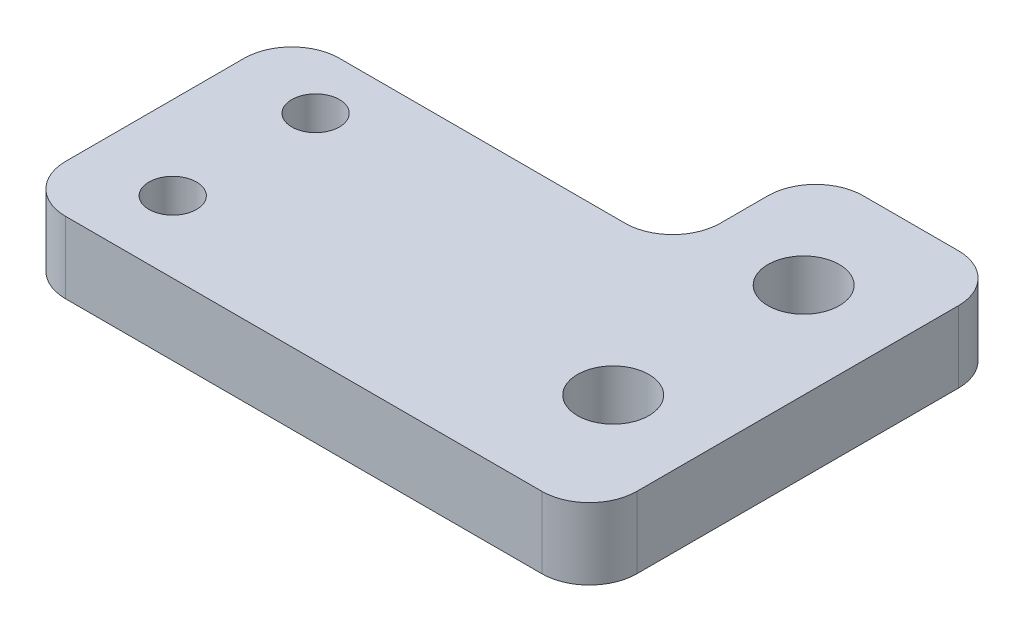
ISO-10303-21;
HEADER;
FILE_DESCRIPTION(('STEP AP214'),'2;1');
FILE_NAME('part.step','',(''),(''),'','','');
FILE_SCHEMA(('AUTOMOTIVE_DESIGN { 1 0 10303 214 1 1 1 1 }'));
ENDSEC;
DATA;
#1=APPLICATION_CONTEXT('core data for automotive mechanical design processes');
#2=APPLICATION_PROTOCOL_DEFINITION('international standard','automotive_design',2000,#1);
#3=PRODUCT_CONTEXT('',#1,'mechanical');
#4=PRODUCT('Part','Part','',(#3));
#5=PRODUCT_RELATED_PRODUCT_CATEGORY('part','',(#4));
#6=PRODUCT_DEFINITION_FORMATION('','',#4);
#7=PRODUCT_DEFINITION_CONTEXT('part definition',#1,'design');
#8=PRODUCT_DEFINITION('design','',#6,#7);
#9=PRODUCT_DEFINITION_SHAPE('','',#8);
#10=(LENGTH_UNIT() NAMED_UNIT(*) SI_UNIT(.MILLI.,.METRE.));
#11=(NAMED_UNIT(*) PLANE_ANGLE_UNIT() SI_UNIT($,.RADIAN.));
#12=(NAMED_UNIT(*) SI_UNIT($,.STERADIAN.) SOLID_ANGLE_UNIT());
#13=UNCERTAINTY_MEASURE_WITH_UNIT(LENGTH_MEASURE(1.E-05),#10,'distance_accuracy_value','');
#14=(GEOMETRIC_REPRESENTATION_CONTEXT(3) GLOBAL_UNCERTAINTY_ASSIGNED_CONTEXT((#13)) GLOBAL_UNIT_ASSIGNED_CONTEXT((#10,
#11,#12)) REPRESENTATION_CONTEXT('',''));
#15=CARTESIAN_POINT('',(0.,0.,0.));
#16=DIRECTION('',(0.,0.,1.));
#17=DIRECTION('',(1.,0.,0.));
#18=AXIS2_PLACEMENT_3D('',#15,#16,#17);
#19=CARTESIAN_POINT('',(-1.5,3.,0.));
#20=DIRECTION('',(-1.,0.,0.));
#21=DIRECTION('',(0.,0.,1.));
#22=AXIS2_PLACEMENT_3D('',#19,#20,#21);
#23=PLANE('',#22);
#24=DIRECTION('',(0.,0.,-1.));
#25=VECTOR('',#24,1.);
#26=CARTESIAN_POINT('',(-1.5,3.,0.));
#27=LINE('',#26,#25);
#28=CARTESIAN_POINT('',(-1.5,3.,-4.5));
#29=VERTEX_POINT('',#28);
#30=CARTESIAN_POINT('',(-1.5,3.,-6.5));
#31=VERTEX_POINT('',#30);
#32=EDGE_CURVE('E179',#29,#31,#27,.T.);
#33=ORIENTED_EDGE('',*,*,#32,.T.);
#34=DIRECTION('',(0.,1.,0.));
#35=VECTOR('',#34,1.);
#36=CARTESIAN_POINT('',(-1.5,0.,-6.5));
#37=LINE('',#36,#35);
#38=CARTESIAN_POINT('',(-1.5,0.,-6.5));
#39=VERTEX_POINT('',#38);
#40=EDGE_CURVE('E58',#31,#39,#37,.F.);
#41=ORIENTED_EDGE('',*,*,#40,.T.);
#42=DIRECTION('',(0.,0.,-1.));
#43=VECTOR('',#42,1.);
#44=CARTESIAN_POINT('',(-1.5,0.,0.));
#45=LINE('',#44,#43);
#46=CARTESIAN_POINT('',(-1.5,0.,-4.5));
#47=VERTEX_POINT('',#46);
#48=EDGE_CURVE('E198',#47,#39,#45,.T.);
#49=ORIENTED_EDGE('',*,*,#48,.F.);
#50=DIRECTION('',(0.,-1.,0.));
#51=VECTOR('',#50,1.);
#52=CARTESIAN_POINT('',(-1.5,3.,-4.5));
#53=LINE('',#52,#51);
#54=EDGE_CURVE('E230',#47,#29,#53,.F.);
#55=ORIENTED_EDGE('',*,*,#54,.T.);
#56=EDGE_LOOP('',(#33,#41,#49,#55));
#57=FACE_BOUND('',#56,.T.);
#58=ADVANCED_FACE('F43',(#57),#23,.T.);
#59=CARTESIAN_POINT('',(0.,3.,-2.5));
#60=DIRECTION('',(0.,0.,-1.));
#61=DIRECTION('',(-1.,0.,0.));
#62=AXIS2_PLACEMENT_3D('',#59,#60,#61);
#63=PLANE('',#62);
#64=DIRECTION('',(1.,0.,0.));
#65=VECTOR('',#64,1.);
#66=CARTESIAN_POINT('',(0.,0.,-2.5));
#67=LINE('',#66,#65);
#68=CARTESIAN_POINT('',(-15.5,0.,-2.5));
#69=VERTEX_POINT('',#68);
#70=CARTESIAN_POINT('',(-3.5,0.,-2.5));
#71=VERTEX_POINT('',#70);
#72=EDGE_CURVE('E200',#69,#71,#67,.T.);
#73=ORIENTED_EDGE('',*,*,#72,.F.);
#74=DIRECTION('',(0.,-1.,0.));
#75=VECTOR('',#74,1.);
#76=CARTESIAN_POINT('',(-15.5,3.,-2.5));
#77=LINE('',#76,#75);
#78=CARTESIAN_POINT('',(-15.5,3.,-2.5));
#79=VERTEX_POINT('',#78);
#80=EDGE_CURVE('E247',#69,#79,#77,.F.);
#81=ORIENTED_EDGE('',*,*,#80,.T.);
#82=DIRECTION('',(1.,0.,0.));
#83=VECTOR('',#82,1.);
#84=CARTESIAN_POINT('',(0.,3.,-2.5));
#85=LINE('',#84,#83);
#86=CARTESIAN_POINT('',(-3.5,3.,-2.5));
#87=VERTEX_POINT('',#86);
#88=EDGE_CURVE('E181',#79,#87,#85,.T.);
#89=ORIENTED_EDGE('',*,*,#88,.T.);
#90=DIRECTION('',(0.,-1.,0.));
#91=VECTOR('',#90,1.);
#92=CARTESIAN_POINT('',(-3.5,0.,-2.5));
#93=LINE('',#92,#91);
#94=EDGE_CURVE('E244',#87,#71,#93,.T.);
#95=ORIENTED_EDGE('',*,*,#94,.T.);
#96=EDGE_LOOP('',(#73,#81,#89,#95));
#97=FACE_BOUND('',#96,.T.);
#98=ADVANCED_FACE('F252',(#97),#63,.T.);
#99=CARTESIAN_POINT('',(-17.5,3.,0.));
#100=DIRECTION('',(-1.,0.,0.));
#101=DIRECTION('',(0.,0.,1.));
#102=AXIS2_PLACEMENT_3D('',#99,#100,#101);
#103=PLANE('',#102);
#104=DIRECTION('',(0.,0.,-1.));
#105=VECTOR('',#104,1.);
#106=CARTESIAN_POINT('',(-17.5,0.,0.));
#107=LINE('',#106,#105);
#108=CARTESIAN_POINT('',(-17.5,0.,7.));
#109=VERTEX_POINT('',#108);
#110=CARTESIAN_POINT('',(-17.5,0.,-0.499999999999998));
#111=VERTEX_POINT('',#110);
#112=EDGE_CURVE('E202',#109,#111,#107,.T.);
#113=ORIENTED_EDGE('',*,*,#112,.F.);
#114=DIRECTION('',(0.,-1.,0.));
#115=VECTOR('',#114,1.);
#116=CARTESIAN_POINT('',(-17.5,3.,7.));
#117=LINE('',#116,#115);
#118=CARTESIAN_POINT('',(-17.5,3.,7.));
#119=VERTEX_POINT('',#118);
#120=EDGE_CURVE('E242',#109,#119,#117,.F.);
#121=ORIENTED_EDGE('',*,*,#120,.T.);
#122=DIRECTION('',(0.,0.,-1.));
#123=VECTOR('',#122,1.);
#124=CARTESIAN_POINT('',(-17.5,3.,0.));
#125=LINE('',#124,#123);
#126=CARTESIAN_POINT('',(-17.5,3.,-0.499999999999998));
#127=VERTEX_POINT('',#126);
#128=EDGE_CURVE('E184',#119,#127,#125,.T.);
#129=ORIENTED_EDGE('',*,*,#128,.T.);
#130=DIRECTION('',(0.,-1.,0.));
#131=VECTOR('',#130,1.);
#132=CARTESIAN_POINT('',(-17.5,3.,-0.499999999999998));
#133=LINE('',#132,#131);
#134=EDGE_CURVE('E239',#127,#111,#133,.T.);
#135=ORIENTED_EDGE('',*,*,#134,.T.);
#136=EDGE_LOOP('',(#113,#121,#129,#135));
#137=FACE_BOUND('',#136,.T.);
#138=ADVANCED_FACE('F263',(#137),#103,.T.);
#139=CARTESIAN_POINT('',(0.,3.,9.));
#140=DIRECTION('',(0.,0.,-1.));
#141=DIRECTION('',(-1.,0.,0.));
#142=AXIS2_PLACEMENT_3D('',#139,#140,#141);
#143=PLANE('',#142);
#144=DIRECTION('',(1.,0.,0.));
#145=VECTOR('',#144,1.);
#146=CARTESIAN_POINT('',(0.,3.,9.));
#147=LINE('',#146,#145);
#148=CARTESIAN_POINT('',(-15.5,3.,9.));
#149=VERTEX_POINT('',#148);
#150=CARTESIAN_POINT('',(4.50000000000001,3.,9.));
#151=VERTEX_POINT('',#150);
#152=EDGE_CURVE('E187',#149,#151,#147,.T.);
#153=ORIENTED_EDGE('',*,*,#152,.F.);
#154=DIRECTION('',(0.,-1.,0.));
#155=VECTOR('',#154,1.);
#156=CARTESIAN_POINT('',(-15.5,0.,9.));
#157=LINE('',#156,#155);
#158=CARTESIAN_POINT('',(-15.5,0.,9.));
#159=VERTEX_POINT('',#158);
#160=EDGE_CURVE('E236',#149,#159,#157,.T.);
#161=ORIENTED_EDGE('',*,*,#160,.T.);
#162=DIRECTION('',(1.,0.,0.));
#163=VECTOR('',#162,1.);
#164=CARTESIAN_POINT('',(0.,0.,9.));
#165=LINE('',#164,#163);
#166=CARTESIAN_POINT('',(4.50000000000001,0.,9.));
#167=VERTEX_POINT('',#166);
#168=EDGE_CURVE('E170',#159,#167,#165,.T.);
#169=ORIENTED_EDGE('',*,*,#168,.T.);
#170=DIRECTION('',(0.,1.,0.));
#171=VECTOR('',#170,1.);
#172=CARTESIAN_POINT('',(4.50000000000001,3.,9.));
#173=LINE('',#172,#171);
#174=EDGE_CURVE('E233',#167,#151,#173,.T.);
#175=ORIENTED_EDGE('',*,*,#174,.T.);
#176=EDGE_LOOP('',(#153,#161,#169,#175));
#177=FACE_BOUND('',#176,.T.);
#178=ADVANCED_FACE('F273',(#177),#143,.F.);
#179=CARTESIAN_POINT('',(2.5,3.,-4.));
#180=DIRECTION('',(0.,-1.,0.));
#181=DIRECTION('',(0.,0.,-1.));
#182=AXIS2_PLACEMENT_3D('',#179,#180,#181);
#183=CYLINDRICAL_SURFACE('',#182,1.5);
#184=CARTESIAN_POINT('',(2.5,3.,-4.));
#185=DIRECTION('',(0.,1.,0.));
#186=DIRECTION('',(0.,0.,1.));
#187=AXIS2_PLACEMENT_3D('',#184,#185,#186);
#188=CIRCLE('',#187,1.5);
#189=CARTESIAN_POINT('',(2.5,3.,-2.5));
#190=VERTEX_POINT('',#189);
#191=EDGE_CURVE('E176',#190,#190,#188,.T.);
#192=ORIENTED_EDGE('',*,*,#191,.T.);
#193=EDGE_LOOP('',(#192));
#194=FACE_BOUND('',#193,.T.);
#195=CARTESIAN_POINT('',(2.5,0.,-4.));
#196=DIRECTION('',(0.,1.,0.));
#197=DIRECTION('',(0.,0.,1.));
#198=AXIS2_PLACEMENT_3D('',#195,#196,#197);
#199=CIRCLE('',#198,1.5);
#200=CARTESIAN_POINT('',(2.5,0.,-2.5));
#201=VERTEX_POINT('',#200);
#202=EDGE_CURVE('E195',#201,#201,#199,.T.);
#203=ORIENTED_EDGE('',*,*,#202,.F.);
#204=EDGE_LOOP('',(#203));
#205=FACE_BOUND('',#204,.T.);
#206=ADVANCED_FACE('F302',(#194,#205),#183,.F.);
#207=CARTESIAN_POINT('',(2.50000000000001,3.,4.));
#208=DIRECTION('',(0.,-1.,0.));
#209=DIRECTION('',(0.,0.,-1.));
#210=AXIS2_PLACEMENT_3D('',#207,#208,#209);
#211=CYLINDRICAL_SURFACE('',#210,1.5);
#212=CARTESIAN_POINT('',(2.50000000000001,3.,4.));
#213=DIRECTION('',(0.,1.,0.));
#214=DIRECTION('',(0.,0.,1.));
#215=AXIS2_PLACEMENT_3D('',#212,#213,#214);
#216=CIRCLE('',#215,1.5);
#217=CARTESIAN_POINT('',(2.50000000000001,3.,5.5));
#218=VERTEX_POINT('',#217);
#219=EDGE_CURVE('E173',#218,#218,#216,.T.);
#220=ORIENTED_EDGE('',*,*,#219,.T.);
#221=EDGE_LOOP('',(#220));
#222=FACE_BOUND('',#221,.T.);
#223=CARTESIAN_POINT('',(2.50000000000001,0.,4.));
#224=DIRECTION('',(0.,1.,0.));
#225=DIRECTION('',(0.,0.,1.));
#226=AXIS2_PLACEMENT_3D('',#223,#224,#225);
#227=CIRCLE('',#226,1.5);
#228=CARTESIAN_POINT('',(2.50000000000001,0.,5.5));
#229=VERTEX_POINT('',#228);
#230=EDGE_CURVE('E192',#229,#229,#227,.T.);
#231=ORIENTED_EDGE('',*,*,#230,.F.);
#232=EDGE_LOOP('',(#231));
#233=FACE_BOUND('',#232,.T.);
#234=ADVANCED_FACE('F305',(#222,#233),#211,.F.);
#235=CARTESIAN_POINT('',(-14.,3.,0.));
#236=DIRECTION('',(0.,-1.,0.));
#237=DIRECTION('',(0.,0.,-1.));
#238=AXIS2_PLACEMENT_3D('',#235,#236,#237);
#239=CYLINDRICAL_SURFACE('',#238,1.);
#240=CARTESIAN_POINT('',(-14.,3.,0.));
#241=DIRECTION('',(0.,1.,0.));
#242=DIRECTION('',(0.,0.,1.));
#243=AXIS2_PLACEMENT_3D('',#240,#241,#242);
#244=CIRCLE('',#243,1.);
#245=CARTESIAN_POINT('',(-14.,3.,1.));
#246=VERTEX_POINT('',#245);
#247=EDGE_CURVE('E169',#246,#246,#244,.T.);
#248=ORIENTED_EDGE('',*,*,#247,.T.);
#249=EDGE_LOOP('',(#248));
#250=FACE_BOUND('',#249,.T.);
#251=CARTESIAN_POINT('',(-14.,0.,0.));
#252=DIRECTION('',(0.,1.,0.));
#253=DIRECTION('',(0.,0.,1.));
#254=AXIS2_PLACEMENT_3D('',#251,#252,#253);
#255=CIRCLE('',#254,1.);
#256=CARTESIAN_POINT('',(-14.,0.,1.));
#257=VERTEX_POINT('',#256);
#258=EDGE_CURVE('E162',#257,#257,#255,.T.);
#259=ORIENTED_EDGE('',*,*,#258,.F.);
#260=EDGE_LOOP('',(#259));
#261=FACE_BOUND('',#260,.T.);
#262=ADVANCED_FACE('F309',(#250,#261),#239,.F.);
#263=CARTESIAN_POINT('',(-14.,3.,6.));
#264=DIRECTION('',(0.,-1.,0.));
#265=DIRECTION('',(0.,0.,-1.));
#266=AXIS2_PLACEMENT_3D('',#263,#264,#265);
#267=CYLINDRICAL_SURFACE('',#266,1.);
#268=CARTESIAN_POINT('',(-14.,3.,6.));
#269=DIRECTION('',(0.,1.,0.));
#270=DIRECTION('',(0.,0.,1.));
#271=AXIS2_PLACEMENT_3D('',#268,#269,#270);
#272=CIRCLE('',#271,1.);
#273=CARTESIAN_POINT('',(-14.,3.,7.));
#274=VERTEX_POINT('',#273);
#275=EDGE_CURVE('E166',#274,#274,#272,.T.);
#276=ORIENTED_EDGE('',*,*,#275,.T.);
#277=EDGE_LOOP('',(#276));
#278=FACE_BOUND('',#277,.T.);
#279=CARTESIAN_POINT('',(-14.,0.,6.));
#280=DIRECTION('',(0.,1.,0.));
#281=DIRECTION('',(0.,0.,1.));
#282=AXIS2_PLACEMENT_3D('',#279,#280,#281);
#283=CIRCLE('',#282,1.);
#284=CARTESIAN_POINT('',(-14.,0.,7.));
#285=VERTEX_POINT('',#284);
#286=EDGE_CURVE('E158',#285,#285,#283,.T.);
#287=ORIENTED_EDGE('',*,*,#286,.F.);
#288=EDGE_LOOP('',(#287));
#289=FACE_BOUND('',#288,.T.);
#290=ADVANCED_FACE('F313',(#278,#289),#267,.F.);
#291=CARTESIAN_POINT('',(0.,3.,0.));
#292=DIRECTION('',(0.,1.,0.));
#293=DIRECTION('',(0.,0.,1.));
#294=AXIS2_PLACEMENT_3D('',#291,#292,#293);
#295=PLANE('',#294);
#296=DIRECTION('',(0.,0.,1.));
#297=VECTOR('',#296,1.);
#298=CARTESIAN_POINT('',(6.5,3.,0.));
#299=LINE('',#298,#297);
#300=CARTESIAN_POINT('',(6.5,3.,-6.5));
#301=VERTEX_POINT('',#300);
#302=CARTESIAN_POINT('',(6.50000000000001,3.,7.));
#303=VERTEX_POINT('',#302);
#304=EDGE_CURVE('E148',#301,#303,#299,.T.);
#305=ORIENTED_EDGE('',*,*,#304,.F.);
#306=CARTESIAN_POINT('',(4.5,3.,-6.5));
#307=DIRECTION('',(0.,1.,0.));
#308=DIRECTION('',(0.,0.,1.));
#309=AXIS2_PLACEMENT_3D('',#306,#307,#308);
#310=CIRCLE('',#309,2.);
#311=CARTESIAN_POINT('',(4.5,3.,-8.5));
#312=VERTEX_POINT('',#311);
#313=EDGE_CURVE('E131',#301,#312,#310,.T.);
#314=ORIENTED_EDGE('',*,*,#313,.T.);
#315=DIRECTION('',(1.,0.,0.));
#316=VECTOR('',#315,1.);
#317=CARTESIAN_POINT('',(0.,3.,-8.5));
#318=LINE('',#317,#316);
#319=CARTESIAN_POINT('',(0.499999999999995,3.,-8.5));
#320=VERTEX_POINT('',#319);
#321=EDGE_CURVE('E159',#320,#312,#318,.T.);
#322=ORIENTED_EDGE('',*,*,#321,.F.);
#323=CARTESIAN_POINT('',(0.499999999999995,3.,-6.5));
#324=DIRECTION('',(0.,1.,0.));
#325=DIRECTION('',(0.,0.,1.));
#326=AXIS2_PLACEMENT_3D('',#323,#324,#325);
#327=CIRCLE('',#326,2.);
#328=EDGE_CURVE('E142',#320,#31,#327,.T.);
#329=ORIENTED_EDGE('',*,*,#328,.T.);
#330=ORIENTED_EDGE('',*,*,#32,.F.);
#331=CARTESIAN_POINT('',(-3.5,3.,-4.5));
#332=DIRECTION('',(0.,1.,0.));
#333=DIRECTION('',(0.,0.,1.));
#334=AXIS2_PLACEMENT_3D('',#331,#332,#333);
#335=CIRCLE('',#334,2.);
#336=EDGE_CURVE('E11',#29,#87,#335,.F.);
#337=ORIENTED_EDGE('',*,*,#336,.T.);
#338=ORIENTED_EDGE('',*,*,#88,.F.);
#339=CARTESIAN_POINT('',(-15.5,3.,-0.499999999999998));
#340=DIRECTION('',(0.,1.,0.));
#341=DIRECTION('',(0.,0.,1.));
#342=AXIS2_PLACEMENT_3D('',#339,#340,#341);
#343=CIRCLE('',#342,2.);
#344=EDGE_CURVE('E212',#79,#127,#343,.T.);
#345=ORIENTED_EDGE('',*,*,#344,.T.);
#346=ORIENTED_EDGE('',*,*,#128,.F.);
#347=CARTESIAN_POINT('',(-15.5,3.,7.));
#348=DIRECTION('',(0.,1.,0.));
#349=DIRECTION('',(0.,0.,1.));
#350=AXIS2_PLACEMENT_3D('',#347,#348,#349);
#351=CIRCLE('',#350,2.);
#352=EDGE_CURVE('E214',#119,#149,#351,.T.);
#353=ORIENTED_EDGE('',*,*,#352,.T.);
#354=ORIENTED_EDGE('',*,*,#152,.T.);
#355=CARTESIAN_POINT('',(4.50000000000001,3.,7.));
#356=DIRECTION('',(0.,1.,0.));
#357=DIRECTION('',(0.,0.,1.));
#358=AXIS2_PLACEMENT_3D('',#355,#356,#357);
#359=CIRCLE('',#358,2.);
#360=EDGE_CURVE('E152',#151,#303,#359,.T.);
#361=ORIENTED_EDGE('',*,*,#360,.T.);
#362=EDGE_LOOP('',(#305,#314,#322,#329,#330,#337,#338,#345,#346,#353,#354,#361));
#363=FACE_BOUND('',#362,.T.);
#364=ORIENTED_EDGE('',*,*,#275,.F.);
#365=EDGE_LOOP('',(#364));
#366=FACE_BOUND('',#365,.T.);
#367=ORIENTED_EDGE('',*,*,#247,.F.);
#368=EDGE_LOOP('',(#367));
#369=FACE_BOUND('',#368,.T.);
#370=ORIENTED_EDGE('',*,*,#219,.F.);
#371=EDGE_LOOP('',(#370));
#372=FACE_BOUND('',#371,.T.);
#373=ORIENTED_EDGE('',*,*,#191,.F.);
#374=EDGE_LOOP('',(#373));
#375=FACE_BOUND('',#374,.T.);
#376=ADVANCED_FACE('F155',(#363,#366,#369,#372,#375),#295,.T.);
#377=CARTESIAN_POINT('',(0.,0.,0.));
#378=DIRECTION('',(0.,1.,0.));
#379=DIRECTION('',(0.,0.,1.));
#380=AXIS2_PLACEMENT_3D('',#377,#378,#379);
#381=PLANE('',#380);
#382=ORIENTED_EDGE('',*,*,#286,.T.);
#383=EDGE_LOOP('',(#382));
#384=FACE_BOUND('',#383,.T.);
#385=ORIENTED_EDGE('',*,*,#258,.T.);
#386=EDGE_LOOP('',(#385));
#387=FACE_BOUND('',#386,.T.);
#388=ORIENTED_EDGE('',*,*,#230,.T.);
#389=EDGE_LOOP('',(#388));
#390=FACE_BOUND('',#389,.T.);
#391=ORIENTED_EDGE('',*,*,#202,.T.);
#392=EDGE_LOOP('',(#391));
#393=FACE_BOUND('',#392,.T.);
#394=DIRECTION('',(1.,0.,0.));
#395=VECTOR('',#394,1.);
#396=CARTESIAN_POINT('',(0.,0.,-8.5));
#397=LINE('',#396,#395);
#398=CARTESIAN_POINT('',(0.499999999999995,0.,-8.5));
#399=VERTEX_POINT('',#398);
#400=CARTESIAN_POINT('',(4.5,0.,-8.5));
#401=VERTEX_POINT('',#400);
#402=EDGE_CURVE('E188',#399,#401,#397,.T.);
#403=ORIENTED_EDGE('',*,*,#402,.T.);
#404=CARTESIAN_POINT('',(4.5,0.,-6.5));
#405=DIRECTION('',(0.,1.,0.));
#406=DIRECTION('',(0.,0.,1.));
#407=AXIS2_PLACEMENT_3D('',#404,#405,#406);
#408=CIRCLE('',#407,2.);
#409=CARTESIAN_POINT('',(6.5,0.,-6.5));
#410=VERTEX_POINT('',#409);
#411=EDGE_CURVE('E228',#401,#410,#408,.F.);
#412=ORIENTED_EDGE('',*,*,#411,.T.);
#413=DIRECTION('',(0.,0.,1.));
#414=VECTOR('',#413,1.);
#415=CARTESIAN_POINT('',(6.5,0.,0.));
#416=LINE('',#415,#414);
#417=CARTESIAN_POINT('',(6.50000000000001,0.,7.));
#418=VERTEX_POINT('',#417);
#419=EDGE_CURVE('E151',#410,#418,#416,.T.);
#420=ORIENTED_EDGE('',*,*,#419,.T.);
#421=CARTESIAN_POINT('',(4.50000000000001,0.,7.));
#422=DIRECTION('',(0.,1.,0.));
#423=DIRECTION('',(0.,0.,1.));
#424=AXIS2_PLACEMENT_3D('',#421,#422,#423);
#425=CIRCLE('',#424,2.);
#426=EDGE_CURVE('E220',#418,#167,#425,.F.);
#427=ORIENTED_EDGE('',*,*,#426,.T.);
#428=ORIENTED_EDGE('',*,*,#168,.F.);
#429=CARTESIAN_POINT('',(-15.5,0.,7.));
#430=DIRECTION('',(0.,1.,0.));
#431=DIRECTION('',(0.,0.,1.));
#432=AXIS2_PLACEMENT_3D('',#429,#430,#431);
#433=CIRCLE('',#432,2.);
#434=EDGE_CURVE('E224',#159,#109,#433,.F.);
#435=ORIENTED_EDGE('',*,*,#434,.T.);
#436=ORIENTED_EDGE('',*,*,#112,.T.);
#437=CARTESIAN_POINT('',(-15.5,0.,-0.499999999999998));
#438=DIRECTION('',(0.,1.,0.));
#439=DIRECTION('',(0.,0.,1.));
#440=AXIS2_PLACEMENT_3D('',#437,#438,#439);
#441=CIRCLE('',#440,2.);
#442=EDGE_CURVE('E222',#111,#69,#441,.F.);
#443=ORIENTED_EDGE('',*,*,#442,.T.);
#444=ORIENTED_EDGE('',*,*,#72,.T.);
#445=CARTESIAN_POINT('',(-3.5,0.,-4.5));
#446=DIRECTION('',(0.,1.,0.));
#447=DIRECTION('',(0.,0.,1.));
#448=AXIS2_PLACEMENT_3D('',#445,#446,#447);
#449=CIRCLE('',#448,2.);
#450=EDGE_CURVE('E51',#71,#47,#449,.T.);
#451=ORIENTED_EDGE('',*,*,#450,.T.);
#452=ORIENTED_EDGE('',*,*,#48,.T.);
#453=CARTESIAN_POINT('',(0.499999999999995,0.,-6.5));
#454=DIRECTION('',(0.,1.,0.));
#455=DIRECTION('',(0.,0.,1.));
#456=AXIS2_PLACEMENT_3D('',#453,#454,#455);
#457=CIRCLE('',#456,2.);
#458=EDGE_CURVE('E226',#39,#399,#457,.F.);
#459=ORIENTED_EDGE('',*,*,#458,.T.);
#460=EDGE_LOOP('',(#403,#412,#420,#427,#428,#435,#436,#443,#444,#451,#452,#459));
#461=FACE_BOUND('',#460,.T.);
#462=ADVANCED_FACE('F265',(#384,#387,#390,#393,#461),#381,.F.);
#463=CARTESIAN_POINT('',(6.5,-7.,0.));
#464=DIRECTION('',(-1.,0.,0.));
#465=DIRECTION('',(0.,0.,1.));
#466=AXIS2_PLACEMENT_3D('',#463,#464,#465);
#467=PLANE('',#466);
#468=ORIENTED_EDGE('',*,*,#419,.F.);
#469=DIRECTION('',(0.,1.,0.));
#470=VECTOR('',#469,1.);
#471=CARTESIAN_POINT('',(6.5,-7.,-6.5));
#472=LINE('',#471,#470);
#473=EDGE_CURVE('E135',#410,#301,#472,.T.);
#474=ORIENTED_EDGE('',*,*,#473,.T.);
#475=ORIENTED_EDGE('',*,*,#304,.T.);
#476=DIRECTION('',(0.,1.,0.));
#477=VECTOR('',#476,1.);
#478=CARTESIAN_POINT('',(6.50000000000001,-7.,7.));
#479=LINE('',#478,#477);
#480=EDGE_CURVE('E153',#303,#418,#479,.F.);
#481=ORIENTED_EDGE('',*,*,#480,.T.);
#482=EDGE_LOOP('',(#468,#474,#475,#481));
#483=FACE_BOUND('',#482,.T.);
#484=ADVANCED_FACE('F147',(#483),#467,.F.);
#485=CARTESIAN_POINT('',(0.,-7.,-8.5));
#486=DIRECTION('',(0.,0.,1.));
#487=DIRECTION('',(1.,0.,0.));
#488=AXIS2_PLACEMENT_3D('',#485,#486,#487);
#489=PLANE('',#488);
#490=ORIENTED_EDGE('',*,*,#321,.T.);
#491=DIRECTION('',(0.,1.,0.));
#492=VECTOR('',#491,1.);
#493=CARTESIAN_POINT('',(4.5,-7.,-8.5));
#494=LINE('',#493,#492);
#495=EDGE_CURVE('E136',#312,#401,#494,.F.);
#496=ORIENTED_EDGE('',*,*,#495,.T.);
#497=ORIENTED_EDGE('',*,*,#402,.F.);
#498=DIRECTION('',(0.,1.,0.));
#499=VECTOR('',#498,1.);
#500=CARTESIAN_POINT('',(0.499999999999995,3.,-8.5));
#501=LINE('',#500,#499);
#502=EDGE_CURVE('E141',#399,#320,#501,.T.);
#503=ORIENTED_EDGE('',*,*,#502,.T.);
#504=EDGE_LOOP('',(#490,#496,#497,#503));
#505=FACE_BOUND('',#504,.T.);
#506=ADVANCED_FACE('F281',(#505),#489,.F.);
#507=CARTESIAN_POINT('',(4.5,-7.,-6.5));
#508=DIRECTION('',(0.,1.,0.));
#509=DIRECTION('',(0.,0.,1.));
#510=AXIS2_PLACEMENT_3D('',#507,#508,#509);
#511=CYLINDRICAL_SURFACE('',#510,2.);
#512=ORIENTED_EDGE('',*,*,#411,.F.);
#513=ORIENTED_EDGE('',*,*,#495,.F.);
#514=ORIENTED_EDGE('',*,*,#313,.F.);
#515=ORIENTED_EDGE('',*,*,#473,.F.);
#516=EDGE_LOOP('',(#512,#513,#514,#515));
#517=FACE_BOUND('',#516,.T.);
#518=ADVANCED_FACE('F134',(#517),#511,.T.);
#519=CARTESIAN_POINT('',(0.499999999999995,-7.,-6.5));
#520=DIRECTION('',(0.,-1.,0.));
#521=DIRECTION('',(0.,0.,-1.));
#522=AXIS2_PLACEMENT_3D('',#519,#520,#521);
#523=CYLINDRICAL_SURFACE('',#522,2.);
#524=ORIENTED_EDGE('',*,*,#458,.F.);
#525=ORIENTED_EDGE('',*,*,#40,.F.);
#526=ORIENTED_EDGE('',*,*,#328,.F.);
#527=ORIENTED_EDGE('',*,*,#502,.F.);
#528=EDGE_LOOP('',(#524,#525,#526,#527));
#529=FACE_BOUND('',#528,.T.);
#530=ADVANCED_FACE('F283',(#529),#523,.T.);
#531=CARTESIAN_POINT('',(-15.5,3.,7.));
#532=DIRECTION('',(0.,1.,0.));
#533=DIRECTION('',(0.,0.,1.));
#534=AXIS2_PLACEMENT_3D('',#531,#532,#533);
#535=CYLINDRICAL_SURFACE('',#534,2.);
#536=ORIENTED_EDGE('',*,*,#352,.F.);
#537=ORIENTED_EDGE('',*,*,#120,.F.);
#538=ORIENTED_EDGE('',*,*,#434,.F.);
#539=ORIENTED_EDGE('',*,*,#160,.F.);
#540=EDGE_LOOP('',(#536,#537,#538,#539));
#541=FACE_BOUND('',#540,.T.);
#542=ADVANCED_FACE('F270',(#541),#535,.T.);
#543=CARTESIAN_POINT('',(-15.5,3.,-0.499999999999998));
#544=DIRECTION('',(0.,-1.,0.));
#545=DIRECTION('',(0.,0.,-1.));
#546=AXIS2_PLACEMENT_3D('',#543,#544,#545);
#547=CYLINDRICAL_SURFACE('',#546,2.);
#548=ORIENTED_EDGE('',*,*,#344,.F.);
#549=ORIENTED_EDGE('',*,*,#80,.F.);
#550=ORIENTED_EDGE('',*,*,#442,.F.);
#551=ORIENTED_EDGE('',*,*,#134,.F.);
#552=EDGE_LOOP('',(#548,#549,#550,#551));
#553=FACE_BOUND('',#552,.T.);
#554=ADVANCED_FACE('F260',(#553),#547,.T.);
#555=CARTESIAN_POINT('',(-3.5,3.,-4.5));
#556=DIRECTION('',(0.,1.,0.));
#557=DIRECTION('',(0.,0.,1.));
#558=AXIS2_PLACEMENT_3D('',#555,#556,#557);
#559=CYLINDRICAL_SURFACE('',#558,2.);
#560=ORIENTED_EDGE('',*,*,#336,.F.);
#561=ORIENTED_EDGE('',*,*,#54,.F.);
#562=ORIENTED_EDGE('',*,*,#450,.F.);
#563=ORIENTED_EDGE('',*,*,#94,.F.);
#564=EDGE_LOOP('',(#560,#561,#562,#563));
#565=FACE_BOUND('',#564,.T.);
#566=ADVANCED_FACE('F286',(#565),#559,.F.);
#567=CARTESIAN_POINT('',(4.50000000000001,3.,7.));
#568=DIRECTION('',(0.,1.,0.));
#569=DIRECTION('',(0.,0.,1.));
#570=AXIS2_PLACEMENT_3D('',#567,#568,#569);
#571=CYLINDRICAL_SURFACE('',#570,2.);
#572=ORIENTED_EDGE('',*,*,#426,.F.);
#573=ORIENTED_EDGE('',*,*,#480,.F.);
#574=ORIENTED_EDGE('',*,*,#360,.F.);
#575=ORIENTED_EDGE('',*,*,#174,.F.);
#576=EDGE_LOOP('',(#572,#573,#574,#575));
#577=FACE_BOUND('',#576,.T.);
#578=ADVANCED_FACE('F45',(#577),#571,.T.);
#579=CLOSED_SHELL('',(#58,#98,#138,#178,#206,#234,#262,#290,#376,#462,#484,#506,#518,#530,#542,
#554,#566,#578));
#580=MANIFOLD_SOLID_BREP('B2',#579);
#581=ADVANCED_BREP_SHAPE_REPRESENTATION('',(#18,#580),#14);
#582=SHAPE_DEFINITION_REPRESENTATION(#9,#581);
ENDSEC;
END-ISO-10303-21;
